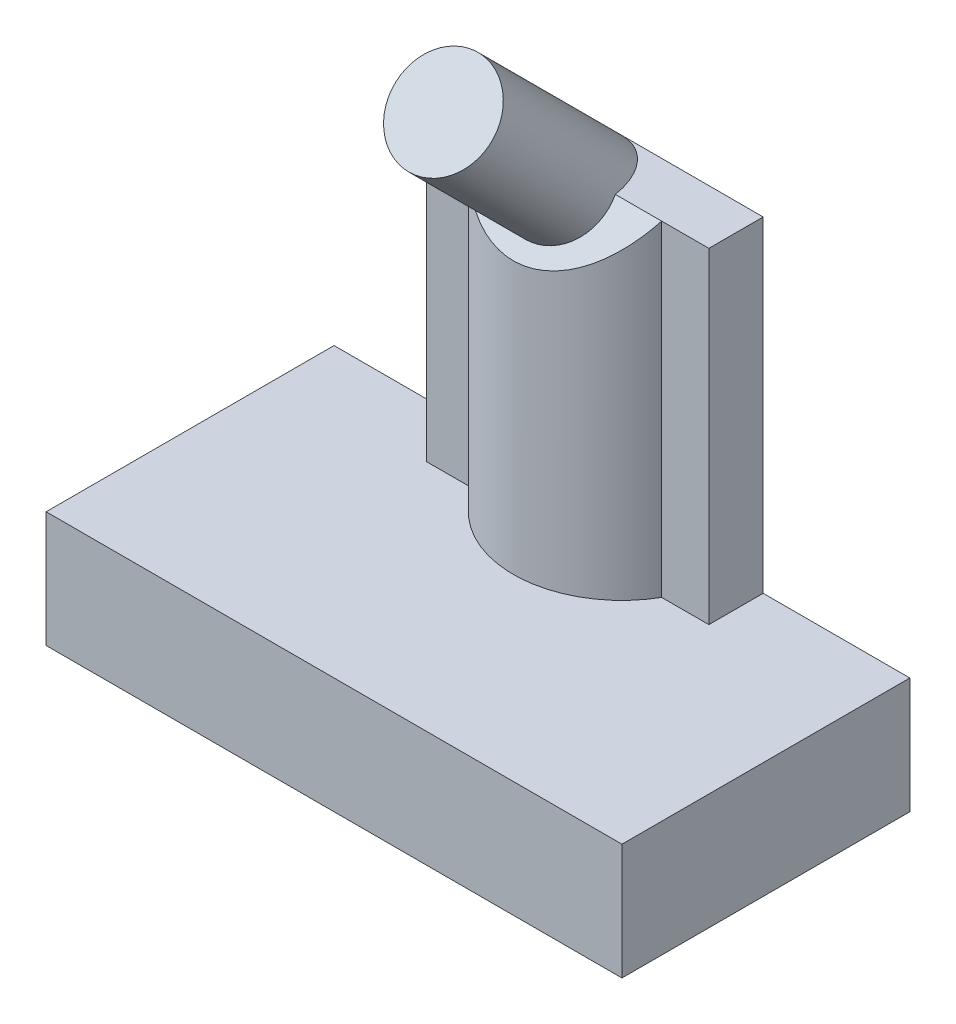
ISO-10303-21;
HEADER;
FILE_DESCRIPTION(('STEP AP214'),'2;1');
FILE_NAME('part.step','',(''),(''),'','','');
FILE_SCHEMA(('AUTOMOTIVE_DESIGN { 1 0 10303 214 1 1 1 1 }'));
ENDSEC;
DATA;
#1=APPLICATION_CONTEXT('core data for automotive mechanical design processes');
#2=APPLICATION_PROTOCOL_DEFINITION('international standard','automotive_design',2000,#1);
#3=PRODUCT_CONTEXT('',#1,'mechanical');
#4=PRODUCT('Part','Part','',(#3));
#5=PRODUCT_RELATED_PRODUCT_CATEGORY('part','',(#4));
#6=PRODUCT_DEFINITION_FORMATION('','',#4);
#7=PRODUCT_DEFINITION_CONTEXT('part definition',#1,'design');
#8=PRODUCT_DEFINITION('design','',#6,#7);
#9=PRODUCT_DEFINITION_SHAPE('','',#8);
#10=(LENGTH_UNIT() NAMED_UNIT(*) SI_UNIT(.MILLI.,.METRE.));
#11=(NAMED_UNIT(*) PLANE_ANGLE_UNIT() SI_UNIT($,.RADIAN.));
#12=(NAMED_UNIT(*) SI_UNIT($,.STERADIAN.) SOLID_ANGLE_UNIT());
#13=UNCERTAINTY_MEASURE_WITH_UNIT(LENGTH_MEASURE(1.E-05),#10,'distance_accuracy_value','');
#14=(GEOMETRIC_REPRESENTATION_CONTEXT(3) GLOBAL_UNCERTAINTY_ASSIGNED_CONTEXT((#13)) GLOBAL_UNIT_ASSIGNED_CONTEXT((#10,
#11,#12)) REPRESENTATION_CONTEXT('',''));
#15=CARTESIAN_POINT('',(0.,0.,0.));
#16=DIRECTION('',(0.,0.,1.));
#17=DIRECTION('',(1.,0.,0.));
#18=AXIS2_PLACEMENT_3D('',#15,#16,#17);
#19=CARTESIAN_POINT('',(0.,12.2,-3.97500000000002));
#20=DIRECTION('',(0.,1.,0.));
#21=DIRECTION('',(0.,0.,1.));
#22=AXIS2_PLACEMENT_3D('',#19,#20,#21);
#23=PLANE('',#22);
#24=CARTESIAN_POINT('',(0.,12.2,-2.06581169079635));
#25=DIRECTION('',(0.,1.,0.));
#26=DIRECTION('',(0.,0.,1.));
#27=AXIS2_PLACEMENT_3D('',#24,#25,#26);
#28=ELLIPSE('',#27,1.90918830920368,1.35);
#29=CARTESIAN_POINT('',(1.31881276962224,12.2,-2.47381384442135));
#30=VERTEX_POINT('',#29);
#31=CARTESIAN_POINT('',(0.,12.2,-3.97500000000002));
#32=VERTEX_POINT('',#31);
#33=EDGE_CURVE('E163',#30,#32,#28,.T.);
#34=ORIENTED_EDGE('',*,*,#33,.F.);
#35=DIRECTION('',(1.,0.,0.));
#36=VECTOR('',#35,1.);
#37=CARTESIAN_POINT('',(0.,12.2,-2.47381384442135));
#38=LINE('',#37,#36);
#39=CARTESIAN_POINT('',(2.59739102298805,12.2,-2.47381384442135));
#40=VERTEX_POINT('',#39);
#41=EDGE_CURVE('E152',#30,#40,#38,.T.);
#42=ORIENTED_EDGE('',*,*,#41,.T.);
#43=CARTESIAN_POINT('',(0.,12.2,-3.97500000000002));
#44=DIRECTION('',(0.,1.,0.));
#45=DIRECTION('',(0.,0.,1.));
#46=AXIS2_PLACEMENT_3D('',#43,#44,#45);
#47=CIRCLE('',#46,3.);
#48=CARTESIAN_POINT('',(2.59807621135332,12.2,-2.47500000000002));
#49=VERTEX_POINT('',#48);
#50=EDGE_CURVE('E189',#40,#49,#47,.T.);
#51=ORIENTED_EDGE('',*,*,#50,.T.);
#52=DIRECTION('',(1.,0.,0.));
#53=VECTOR('',#52,1.);
#54=CARTESIAN_POINT('',(2.59807621135332,12.2,-2.47500000000002));
#55=LINE('',#54,#53);
#56=CARTESIAN_POINT('',(3.9,12.2,-2.47500000000002));
#57=VERTEX_POINT('',#56);
#58=EDGE_CURVE('E194',#49,#57,#55,.T.);
#59=ORIENTED_EDGE('',*,*,#58,.T.);
#60=DIRECTION('',(0.,0.,-1.));
#61=VECTOR('',#60,1.);
#62=CARTESIAN_POINT('',(3.9,12.2,-2.47500000000002));
#63=LINE('',#62,#61);
#64=CARTESIAN_POINT('',(3.9,12.2,-3.97500000000002));
#65=VERTEX_POINT('',#64);
#66=EDGE_CURVE('E197',#57,#65,#63,.T.);
#67=ORIENTED_EDGE('',*,*,#66,.T.);
#68=DIRECTION('',(-1.,0.,0.));
#69=VECTOR('',#68,1.);
#70=CARTESIAN_POINT('',(3.9,12.2,-3.97500000000002));
#71=LINE('',#70,#69);
#72=EDGE_CURVE('E165',#65,#32,#71,.T.);
#73=ORIENTED_EDGE('',*,*,#72,.T.);
#74=EDGE_LOOP('',(#34,#42,#51,#59,#67,#73));
#75=FACE_BOUND('',#74,.T.);
#76=ADVANCED_FACE('F39',(#75),#23,.T.);
#77=CARTESIAN_POINT('',(0.,12.2,-3.97500000000002));
#78=DIRECTION('',(0.,-1.,0.));
#79=DIRECTION('',(0.,0.,-1.));
#80=AXIS2_PLACEMENT_3D('',#77,#78,#79);
#81=CYLINDRICAL_SURFACE('',#80,3.);
#82=CARTESIAN_POINT('',(0.,13.7011861555787,-3.97500000000002));
#83=DIRECTION('',(0.,0.707106781186547,0.707106781186548));
#84=DIRECTION('',(0.,-0.707106781186548,0.707106781186547));
#85=AXIS2_PLACEMENT_3D('',#82,#83,#84);
#86=ELLIPSE('',#85,4.24264068711929,3.);
#87=CARTESIAN_POINT('',(-2.59739102298805,12.2,-2.47381384442135));
#88=VERTEX_POINT('',#87);
#89=EDGE_CURVE('E156',#88,#40,#86,.T.);
#90=ORIENTED_EDGE('',*,*,#89,.F.);
#91=CARTESIAN_POINT('',(-2.59807621135332,12.2,-2.47500000000002));
#92=VERTEX_POINT('',#91);
#93=EDGE_CURVE('E190',#92,#88,#47,.T.);
#94=ORIENTED_EDGE('',*,*,#93,.F.);
#95=DIRECTION('',(0.,-1.,0.));
#96=VECTOR('',#95,1.);
#97=CARTESIAN_POINT('',(-2.59807621135332,12.2,-2.47500000000002));
#98=LINE('',#97,#96);
#99=CARTESIAN_POINT('',(-2.59807621135332,3.2,-2.47500000000002));
#100=VERTEX_POINT('',#99);
#101=EDGE_CURVE('E231',#92,#100,#98,.T.);
#102=ORIENTED_EDGE('',*,*,#101,.T.);
#103=CARTESIAN_POINT('',(0.,3.2,-3.97500000000002));
#104=DIRECTION('',(0.,1.,0.));
#105=DIRECTION('',(0.,0.,1.));
#106=AXIS2_PLACEMENT_3D('',#103,#104,#105);
#107=CIRCLE('',#106,3.);
#108=CARTESIAN_POINT('',(2.59807621135332,3.2,-2.47500000000002));
#109=VERTEX_POINT('',#108);
#110=EDGE_CURVE('E208',#100,#109,#107,.T.);
#111=ORIENTED_EDGE('',*,*,#110,.T.);
#112=DIRECTION('',(0.,-1.,0.));
#113=VECTOR('',#112,1.);
#114=CARTESIAN_POINT('',(2.59807621135332,12.2,-2.47500000000002));
#115=LINE('',#114,#113);
#116=EDGE_CURVE('E227',#49,#109,#115,.T.);
#117=ORIENTED_EDGE('',*,*,#116,.F.);
#118=ORIENTED_EDGE('',*,*,#50,.F.);
#119=EDGE_LOOP('',(#90,#94,#102,#111,#117,#118));
#120=FACE_BOUND('',#119,.T.);
#121=ADVANCED_FACE('F347',(#120),#81,.T.);
#122=CARTESIAN_POINT('',(-1.31881276962224,12.2,-2.47381384442135));
#123=VERTEX_POINT('',#122);
#124=EDGE_CURVE('E55',#32,#123,#28,.T.);
#125=ORIENTED_EDGE('',*,*,#124,.F.);
#126=CARTESIAN_POINT('',(-3.9,12.2,-3.97500000000002));
#127=VERTEX_POINT('',#126);
#128=EDGE_CURVE('E183',#32,#127,#71,.T.);
#129=ORIENTED_EDGE('',*,*,#128,.T.);
#130=DIRECTION('',(0.,0.,1.));
#131=VECTOR('',#130,1.);
#132=CARTESIAN_POINT('',(-3.9,12.2,-3.97500000000002));
#133=LINE('',#132,#131);
#134=CARTESIAN_POINT('',(-3.9,12.2,-2.47500000000002));
#135=VERTEX_POINT('',#134);
#136=EDGE_CURVE('E182',#127,#135,#133,.T.);
#137=ORIENTED_EDGE('',*,*,#136,.T.);
#138=DIRECTION('',(1.,0.,0.));
#139=VECTOR('',#138,1.);
#140=CARTESIAN_POINT('',(-3.9,12.2,-2.47500000000002));
#141=LINE('',#140,#139);
#142=EDGE_CURVE('E186',#135,#92,#141,.T.);
#143=ORIENTED_EDGE('',*,*,#142,.T.);
#144=ORIENTED_EDGE('',*,*,#93,.T.);
#145=EDGE_CURVE('E48',#88,#123,#38,.T.);
#146=ORIENTED_EDGE('',*,*,#145,.T.);
#147=EDGE_LOOP('',(#125,#129,#137,#143,#144,#146));
#148=FACE_BOUND('',#147,.T.);
#149=ADVANCED_FACE('F344',(#148),#23,.T.);
#150=CARTESIAN_POINT('',(0.,3.2,0.));
#151=DIRECTION('',(0.,-1.,0.));
#152=DIRECTION('',(0.,0.,-1.));
#153=AXIS2_PLACEMENT_3D('',#150,#151,#152);
#154=PLANE('',#153);
#155=DIRECTION('',(0.,0.,-1.));
#156=VECTOR('',#155,1.);
#157=CARTESIAN_POINT('',(3.9,3.2,-2.47500000000002));
#158=LINE('',#157,#156);
#159=CARTESIAN_POINT('',(3.9,3.2,-2.47500000000002));
#160=VERTEX_POINT('',#159);
#161=CARTESIAN_POINT('',(3.9,3.2,-3.97500000000002));
#162=VERTEX_POINT('',#161);
#163=EDGE_CURVE('E216',#160,#162,#158,.T.);
#164=ORIENTED_EDGE('',*,*,#163,.F.);
#165=DIRECTION('',(1.,0.,0.));
#166=VECTOR('',#165,1.);
#167=CARTESIAN_POINT('',(2.59807621135332,3.2,-2.47500000000002));
#168=LINE('',#167,#166);
#169=EDGE_CURVE('E212',#109,#160,#168,.T.);
#170=ORIENTED_EDGE('',*,*,#169,.F.);
#171=ORIENTED_EDGE('',*,*,#110,.F.);
#172=DIRECTION('',(1.,0.,0.));
#173=VECTOR('',#172,1.);
#174=CARTESIAN_POINT('',(-3.9,3.2,-2.47500000000002));
#175=LINE('',#174,#173);
#176=CARTESIAN_POINT('',(-3.9,3.2,-2.47500000000002));
#177=VERTEX_POINT('',#176);
#178=EDGE_CURVE('E204',#177,#100,#175,.T.);
#179=ORIENTED_EDGE('',*,*,#178,.F.);
#180=DIRECTION('',(0.,0.,1.));
#181=VECTOR('',#180,1.);
#182=CARTESIAN_POINT('',(-3.9,3.2,-3.97500000000002));
#183=LINE('',#182,#181);
#184=CARTESIAN_POINT('',(-3.9,3.2,-3.97500000000002));
#185=VERTEX_POINT('',#184);
#186=EDGE_CURVE('E179',#185,#177,#183,.T.);
#187=ORIENTED_EDGE('',*,*,#186,.F.);
#188=DIRECTION('',(-1.,0.,0.));
#189=VECTOR('',#188,1.);
#190=CARTESIAN_POINT('',(-7.94999999999991,3.2,-3.97500000000002));
#191=LINE('',#190,#189);
#192=CARTESIAN_POINT('',(-7.94999999999991,3.2,-3.97500000000002));
#193=VERTEX_POINT('',#192);
#194=EDGE_CURVE('E303',#185,#193,#191,.T.);
#195=ORIENTED_EDGE('',*,*,#194,.T.);
#196=DIRECTION('',(0.,0.,1.));
#197=VECTOR('',#196,1.);
#198=CARTESIAN_POINT('',(-7.94999999999991,3.2,3.97499999999996));
#199=LINE('',#198,#197);
#200=CARTESIAN_POINT('',(-7.94999999999991,3.2,3.97499999999996));
#201=VERTEX_POINT('',#200);
#202=EDGE_CURVE('E308',#193,#201,#199,.T.);
#203=ORIENTED_EDGE('',*,*,#202,.T.);
#204=DIRECTION('',(1.,0.,0.));
#205=VECTOR('',#204,1.);
#206=CARTESIAN_POINT('',(-7.94999999999991,3.2,3.97499999999996));
#207=LINE('',#206,#205);
#208=CARTESIAN_POINT('',(7.95000000000009,3.2,3.97499999999996));
#209=VERTEX_POINT('',#208);
#210=EDGE_CURVE('E311',#201,#209,#207,.T.);
#211=ORIENTED_EDGE('',*,*,#210,.T.);
#212=DIRECTION('',(0.,0.,-1.));
#213=VECTOR('',#212,1.);
#214=CARTESIAN_POINT('',(7.95000000000009,3.2,3.97499999999996));
#215=LINE('',#214,#213);
#216=CARTESIAN_POINT('',(7.95000000000009,3.2,-3.97500000000002));
#217=VERTEX_POINT('',#216);
#218=EDGE_CURVE('E299',#209,#217,#215,.T.);
#219=ORIENTED_EDGE('',*,*,#218,.T.);
#220=EDGE_CURVE('E305',#217,#162,#191,.T.);
#221=ORIENTED_EDGE('',*,*,#220,.T.);
#222=EDGE_LOOP('',(#164,#170,#171,#179,#187,#195,#203,#211,#219,#221));
#223=FACE_BOUND('',#222,.T.);
#224=ADVANCED_FACE('F365',(#223),#154,.F.);
#225=CARTESIAN_POINT('',(0.,0.,0.));
#226=DIRECTION('',(0.,-1.,0.));
#227=DIRECTION('',(0.,0.,-1.));
#228=AXIS2_PLACEMENT_3D('',#225,#226,#227);
#229=PLANE('',#228);
#230=DIRECTION('',(0.,0.,-1.));
#231=VECTOR('',#230,1.);
#232=CARTESIAN_POINT('',(7.95000000000009,0.,3.97499999999996));
#233=LINE('',#232,#231);
#234=CARTESIAN_POINT('',(7.95000000000009,0.,3.97499999999996));
#235=VERTEX_POINT('',#234);
#236=CARTESIAN_POINT('',(7.95000000000009,0.,-3.97500000000002));
#237=VERTEX_POINT('',#236);
#238=EDGE_CURVE('E260',#235,#237,#233,.T.);
#239=ORIENTED_EDGE('',*,*,#238,.F.);
#240=DIRECTION('',(1.,0.,0.));
#241=VECTOR('',#240,1.);
#242=CARTESIAN_POINT('',(-7.94999999999991,0.,3.97499999999996));
#243=LINE('',#242,#241);
#244=CARTESIAN_POINT('',(-7.94999999999991,0.,3.97499999999996));
#245=VERTEX_POINT('',#244);
#246=EDGE_CURVE('E304',#245,#235,#243,.T.);
#247=ORIENTED_EDGE('',*,*,#246,.F.);
#248=DIRECTION('',(0.,0.,1.));
#249=VECTOR('',#248,1.);
#250=CARTESIAN_POINT('',(-7.94999999999991,0.,3.97499999999996));
#251=LINE('',#250,#249);
#252=CARTESIAN_POINT('',(-7.94999999999991,0.,-3.97500000000002));
#253=VERTEX_POINT('',#252);
#254=EDGE_CURVE('E321',#253,#245,#251,.T.);
#255=ORIENTED_EDGE('',*,*,#254,.F.);
#256=DIRECTION('',(-1.,0.,0.));
#257=VECTOR('',#256,1.);
#258=CARTESIAN_POINT('',(-7.94999999999991,0.,-3.97500000000002));
#259=LINE('',#258,#257);
#260=EDGE_CURVE('E318',#237,#253,#259,.T.);
#261=ORIENTED_EDGE('',*,*,#260,.F.);
#262=EDGE_LOOP('',(#239,#247,#255,#261));
#263=FACE_BOUND('',#262,.T.);
#264=DIRECTION('',(1.,0.,0.));
#265=VECTOR('',#264,1.);
#266=CARTESIAN_POINT('',(0.,0.,2.77499999999996));
#267=LINE('',#266,#265);
#268=CARTESIAN_POINT('',(-6.74999999999991,0.,2.77499999999996));
#269=VERTEX_POINT('',#268);
#270=CARTESIAN_POINT('',(6.75000000000009,0.,2.77499999999996));
#271=VERTEX_POINT('',#270);
#272=EDGE_CURVE('E267',#269,#271,#267,.T.);
#273=ORIENTED_EDGE('',*,*,#272,.T.);
#274=DIRECTION('',(0.,0.,-1.));
#275=VECTOR('',#274,1.);
#276=CARTESIAN_POINT('',(6.75000000000009,0.,0.));
#277=LINE('',#276,#275);
#278=CARTESIAN_POINT('',(6.75000000000009,0.,-2.77500000000002));
#279=VERTEX_POINT('',#278);
#280=EDGE_CURVE('E248',#271,#279,#277,.T.);
#281=ORIENTED_EDGE('',*,*,#280,.T.);
#282=DIRECTION('',(-1.,0.,0.));
#283=VECTOR('',#282,1.);
#284=CARTESIAN_POINT('',(0.,0.,-2.77500000000002));
#285=LINE('',#284,#283);
#286=CARTESIAN_POINT('',(-6.74999999999991,0.,-2.77500000000002));
#287=VERTEX_POINT('',#286);
#288=EDGE_CURVE('E288',#279,#287,#285,.T.);
#289=ORIENTED_EDGE('',*,*,#288,.T.);
#290=DIRECTION('',(0.,0.,1.));
#291=VECTOR('',#290,1.);
#292=CARTESIAN_POINT('',(-6.74999999999991,0.,0.));
#293=LINE('',#292,#291);
#294=EDGE_CURVE('E292',#287,#269,#293,.T.);
#295=ORIENTED_EDGE('',*,*,#294,.T.);
#296=EDGE_LOOP('',(#273,#281,#289,#295));
#297=FACE_BOUND('',#296,.T.);
#298=ADVANCED_FACE('F385',(#263,#297),#229,.T.);
#299=CARTESIAN_POINT('',(7.95000000000009,3.2,3.97499999999996));
#300=DIRECTION('',(-1.,0.,0.));
#301=DIRECTION('',(0.,0.,1.));
#302=AXIS2_PLACEMENT_3D('',#299,#300,#301);
#303=PLANE('',#302);
#304=ORIENTED_EDGE('',*,*,#238,.T.);
#305=DIRECTION('',(0.,-1.,0.));
#306=VECTOR('',#305,1.);
#307=CARTESIAN_POINT('',(7.95000000000009,3.2,-3.97500000000002));
#308=LINE('',#307,#306);
#309=EDGE_CURVE('E337',#217,#237,#308,.T.);
#310=ORIENTED_EDGE('',*,*,#309,.F.);
#311=ORIENTED_EDGE('',*,*,#218,.F.);
#312=DIRECTION('',(0.,-1.,0.));
#313=VECTOR('',#312,1.);
#314=CARTESIAN_POINT('',(7.95000000000009,3.2,3.97499999999996));
#315=LINE('',#314,#313);
#316=EDGE_CURVE('E314',#209,#235,#315,.T.);
#317=ORIENTED_EDGE('',*,*,#316,.T.);
#318=EDGE_LOOP('',(#304,#310,#311,#317));
#319=FACE_BOUND('',#318,.T.);
#320=ADVANCED_FACE('F41',(#319),#303,.F.);
#321=CARTESIAN_POINT('',(-7.94999999999991,3.2,-3.97500000000002));
#322=DIRECTION('',(0.,0.,1.));
#323=DIRECTION('',(1.,0.,0.));
#324=AXIS2_PLACEMENT_3D('',#321,#322,#323);
#325=PLANE('',#324);
#326=ORIENTED_EDGE('',*,*,#260,.T.);
#327=DIRECTION('',(0.,-1.,0.));
#328=VECTOR('',#327,1.);
#329=CARTESIAN_POINT('',(-7.94999999999991,3.2,-3.97500000000002));
#330=LINE('',#329,#328);
#331=EDGE_CURVE('E333',#193,#253,#330,.T.);
#332=ORIENTED_EDGE('',*,*,#331,.F.);
#333=ORIENTED_EDGE('',*,*,#194,.F.);
#334=DIRECTION('',(0.,-1.,0.));
#335=VECTOR('',#334,1.);
#336=CARTESIAN_POINT('',(-3.9,12.2,-3.97500000000002));
#337=LINE('',#336,#335);
#338=EDGE_CURVE('E239',#127,#185,#337,.T.);
#339=ORIENTED_EDGE('',*,*,#338,.F.);
#340=ORIENTED_EDGE('',*,*,#128,.F.);
#341=ORIENTED_EDGE('',*,*,#72,.F.);
#342=DIRECTION('',(0.,-1.,0.));
#343=VECTOR('',#342,1.);
#344=CARTESIAN_POINT('',(3.9,12.2,-3.97500000000002));
#345=LINE('',#344,#343);
#346=EDGE_CURVE('E200',#65,#162,#345,.T.);
#347=ORIENTED_EDGE('',*,*,#346,.T.);
#348=ORIENTED_EDGE('',*,*,#220,.F.);
#349=ORIENTED_EDGE('',*,*,#309,.T.);
#350=EDGE_LOOP('',(#326,#332,#333,#339,#340,#341,#347,#348,#349));
#351=FACE_BOUND('',#350,.T.);
#352=ADVANCED_FACE('F360',(#351),#325,.F.);
#353=CARTESIAN_POINT('',(-7.94999999999991,3.2,3.97499999999996));
#354=DIRECTION('',(1.,0.,0.));
#355=DIRECTION('',(0.,0.,-1.));
#356=AXIS2_PLACEMENT_3D('',#353,#354,#355);
#357=PLANE('',#356);
#358=ORIENTED_EDGE('',*,*,#254,.T.);
#359=DIRECTION('',(0.,-1.,0.));
#360=VECTOR('',#359,1.);
#361=CARTESIAN_POINT('',(-7.94999999999991,3.2,3.97499999999996));
#362=LINE('',#361,#360);
#363=EDGE_CURVE('E329',#201,#245,#362,.T.);
#364=ORIENTED_EDGE('',*,*,#363,.F.);
#365=ORIENTED_EDGE('',*,*,#202,.F.);
#366=ORIENTED_EDGE('',*,*,#331,.T.);
#367=EDGE_LOOP('',(#358,#364,#365,#366));
#368=FACE_BOUND('',#367,.T.);
#369=ADVANCED_FACE('F389',(#368),#357,.F.);
#370=CARTESIAN_POINT('',(-7.94999999999991,3.2,3.97499999999996));
#371=DIRECTION('',(0.,0.,-1.));
#372=DIRECTION('',(-1.,0.,0.));
#373=AXIS2_PLACEMENT_3D('',#370,#371,#372);
#374=PLANE('',#373);
#375=ORIENTED_EDGE('',*,*,#246,.T.);
#376=ORIENTED_EDGE('',*,*,#316,.F.);
#377=ORIENTED_EDGE('',*,*,#210,.F.);
#378=ORIENTED_EDGE('',*,*,#363,.T.);
#379=EDGE_LOOP('',(#375,#376,#377,#378));
#380=FACE_BOUND('',#379,.T.);
#381=ADVANCED_FACE('F391',(#380),#374,.F.);
#382=CARTESIAN_POINT('',(6.75000000000009,3.2,3.97499999999996));
#383=DIRECTION('',(-1.,0.,0.));
#384=DIRECTION('',(0.,0.,1.));
#385=AXIS2_PLACEMENT_3D('',#382,#383,#384);
#386=PLANE('',#385);
#387=ORIENTED_EDGE('',*,*,#280,.F.);
#388=DIRECTION('',(0.,-1.,0.));
#389=VECTOR('',#388,1.);
#390=CARTESIAN_POINT('',(6.75000000000009,3.2,2.77499999999996));
#391=LINE('',#390,#389);
#392=CARTESIAN_POINT('',(6.75000000000009,2.,2.77499999999996));
#393=VERTEX_POINT('',#392);
#394=EDGE_CURVE('E268',#393,#271,#391,.T.);
#395=ORIENTED_EDGE('',*,*,#394,.F.);
#396=DIRECTION('',(0.,0.,-1.));
#397=VECTOR('',#396,1.);
#398=CARTESIAN_POINT('',(6.75000000000009,2.,0.));
#399=LINE('',#398,#397);
#400=CARTESIAN_POINT('',(6.75000000000009,2.,-2.77500000000002));
#401=VERTEX_POINT('',#400);
#402=EDGE_CURVE('E262',#393,#401,#399,.T.);
#403=ORIENTED_EDGE('',*,*,#402,.T.);
#404=DIRECTION('',(0.,-1.,0.));
#405=VECTOR('',#404,1.);
#406=CARTESIAN_POINT('',(6.75000000000009,3.2,-2.77500000000002));
#407=LINE('',#406,#405);
#408=EDGE_CURVE('E256',#401,#279,#407,.T.);
#409=ORIENTED_EDGE('',*,*,#408,.T.);
#410=EDGE_LOOP('',(#387,#395,#403,#409));
#411=FACE_BOUND('',#410,.T.);
#412=ADVANCED_FACE('F393',(#411),#386,.T.);
#413=CARTESIAN_POINT('',(-7.94999999999991,3.2,-2.77500000000002));
#414=DIRECTION('',(0.,0.,1.));
#415=DIRECTION('',(1.,0.,0.));
#416=AXIS2_PLACEMENT_3D('',#413,#414,#415);
#417=PLANE('',#416);
#418=ORIENTED_EDGE('',*,*,#288,.F.);
#419=ORIENTED_EDGE('',*,*,#408,.F.);
#420=DIRECTION('',(-1.,0.,0.));
#421=VECTOR('',#420,1.);
#422=CARTESIAN_POINT('',(0.,2.,-2.77500000000002));
#423=LINE('',#422,#421);
#424=CARTESIAN_POINT('',(-6.74999999999991,2.,-2.77500000000002));
#425=VERTEX_POINT('',#424);
#426=EDGE_CURVE('E266',#401,#425,#423,.T.);
#427=ORIENTED_EDGE('',*,*,#426,.T.);
#428=DIRECTION('',(0.,-1.,0.));
#429=VECTOR('',#428,1.);
#430=CARTESIAN_POINT('',(-6.74999999999991,3.2,-2.77500000000002));
#431=LINE('',#430,#429);
#432=EDGE_CURVE('E261',#425,#287,#431,.T.);
#433=ORIENTED_EDGE('',*,*,#432,.T.);
#434=EDGE_LOOP('',(#418,#419,#427,#433));
#435=FACE_BOUND('',#434,.T.);
#436=ADVANCED_FACE('F399',(#435),#417,.T.);
#437=CARTESIAN_POINT('',(-6.74999999999991,3.2,3.97499999999996));
#438=DIRECTION('',(1.,0.,0.));
#439=DIRECTION('',(0.,0.,-1.));
#440=AXIS2_PLACEMENT_3D('',#437,#438,#439);
#441=PLANE('',#440);
#442=ORIENTED_EDGE('',*,*,#294,.F.);
#443=ORIENTED_EDGE('',*,*,#432,.F.);
#444=DIRECTION('',(0.,0.,1.));
#445=VECTOR('',#444,1.);
#446=CARTESIAN_POINT('',(-6.74999999999991,2.,0.));
#447=LINE('',#446,#445);
#448=CARTESIAN_POINT('',(-6.74999999999991,2.,2.77499999999996));
#449=VERTEX_POINT('',#448);
#450=EDGE_CURVE('E278',#425,#449,#447,.T.);
#451=ORIENTED_EDGE('',*,*,#450,.T.);
#452=DIRECTION('',(0.,-1.,0.));
#453=VECTOR('',#452,1.);
#454=CARTESIAN_POINT('',(-6.74999999999991,3.2,2.77499999999996));
#455=LINE('',#454,#453);
#456=EDGE_CURVE('E271',#449,#269,#455,.T.);
#457=ORIENTED_EDGE('',*,*,#456,.T.);
#458=EDGE_LOOP('',(#442,#443,#451,#457));
#459=FACE_BOUND('',#458,.T.);
#460=ADVANCED_FACE('F430',(#459),#441,.T.);
#461=CARTESIAN_POINT('',(-7.94999999999991,3.2,2.77499999999996));
#462=DIRECTION('',(0.,0.,-1.));
#463=DIRECTION('',(-1.,0.,0.));
#464=AXIS2_PLACEMENT_3D('',#461,#462,#463);
#465=PLANE('',#464);
#466=ORIENTED_EDGE('',*,*,#272,.F.);
#467=ORIENTED_EDGE('',*,*,#456,.F.);
#468=DIRECTION('',(1.,0.,0.));
#469=VECTOR('',#468,1.);
#470=CARTESIAN_POINT('',(0.,2.,2.77499999999996));
#471=LINE('',#470,#469);
#472=EDGE_CURVE('E272',#449,#393,#471,.T.);
#473=ORIENTED_EDGE('',*,*,#472,.T.);
#474=ORIENTED_EDGE('',*,*,#394,.T.);
#475=EDGE_LOOP('',(#466,#467,#473,#474));
#476=FACE_BOUND('',#475,.T.);
#477=ADVANCED_FACE('F425',(#476),#465,.T.);
#478=CARTESIAN_POINT('',(0.,2.,0.));
#479=DIRECTION('',(0.,-1.,0.));
#480=DIRECTION('',(0.,0.,-1.));
#481=AXIS2_PLACEMENT_3D('',#478,#479,#480);
#482=PLANE('',#481);
#483=CARTESIAN_POINT('',(0.,2.,0.));
#484=DIRECTION('',(0.,-1.,0.));
#485=DIRECTION('',(0.,0.,-1.));
#486=AXIS2_PLACEMENT_3D('',#483,#484,#485);
#487=CIRCLE('',#486,1.525);
#488=CARTESIAN_POINT('',(0.,2.,-1.525));
#489=VERTEX_POINT('',#488);
#490=EDGE_CURVE('E249',#489,#489,#487,.T.);
#491=ORIENTED_EDGE('',*,*,#490,.F.);
#492=EDGE_LOOP('',(#491));
#493=FACE_BOUND('',#492,.T.);
#494=ORIENTED_EDGE('',*,*,#402,.F.);
#495=ORIENTED_EDGE('',*,*,#472,.F.);
#496=ORIENTED_EDGE('',*,*,#450,.F.);
#497=ORIENTED_EDGE('',*,*,#426,.F.);
#498=EDGE_LOOP('',(#494,#495,#496,#497));
#499=FACE_BOUND('',#498,.T.);
#500=ADVANCED_FACE('F421',(#493,#499),#482,.T.);
#501=CARTESIAN_POINT('',(0.,-4.31335136523794,0.));
#502=DIRECTION('',(0.,1.,0.));
#503=DIRECTION('',(0.,0.,1.));
#504=AXIS2_PLACEMENT_3D('',#501,#502,#503);
#505=CYLINDRICAL_SURFACE('',#504,1.525);
#506=ORIENTED_EDGE('',*,*,#490,.T.);
#507=EDGE_LOOP('',(#506));
#508=FACE_BOUND('',#507,.T.);
#509=CARTESIAN_POINT('',(0.,0.,0.));
#510=DIRECTION('',(0.,-1.,0.));
#511=DIRECTION('',(0.,0.,-1.));
#512=AXIS2_PLACEMENT_3D('',#509,#510,#511);
#513=CIRCLE('',#512,1.525);
#514=CARTESIAN_POINT('',(0.,0.,-1.525));
#515=VERTEX_POINT('',#514);
#516=EDGE_CURVE('E244',#515,#515,#513,.T.);
#517=ORIENTED_EDGE('',*,*,#516,.F.);
#518=EDGE_LOOP('',(#517));
#519=FACE_BOUND('',#518,.T.);
#520=ADVANCED_FACE('F424',(#508,#519),#505,.T.);
#521=CARTESIAN_POINT('',(0.,-4.31335136523794,0.));
#522=DIRECTION('',(0.,1.,0.));
#523=DIRECTION('',(0.,0.,1.));
#524=AXIS2_PLACEMENT_3D('',#521,#522,#523);
#525=CYLINDRICAL_SURFACE('',#524,0.5);
#526=CARTESIAN_POINT('',(0.,2.,0.));
#527=DIRECTION('',(0.,-1.,0.));
#528=DIRECTION('',(0.,0.,-1.));
#529=AXIS2_PLACEMENT_3D('',#526,#527,#528);
#530=CIRCLE('',#529,0.5);
#531=CARTESIAN_POINT('',(0.,2.,-0.5));
#532=VERTEX_POINT('',#531);
#533=EDGE_CURVE('E160',#532,#532,#530,.F.);
#534=ORIENTED_EDGE('',*,*,#533,.T.);
#535=EDGE_LOOP('',(#534));
#536=FACE_BOUND('',#535,.T.);
#537=CARTESIAN_POINT('',(0.,0.,0.));
#538=DIRECTION('',(0.,-1.,0.));
#539=DIRECTION('',(0.,0.,-1.));
#540=AXIS2_PLACEMENT_3D('',#537,#538,#539);
#541=CIRCLE('',#540,0.5);
#542=CARTESIAN_POINT('',(0.,0.,-0.5));
#543=VERTEX_POINT('',#542);
#544=EDGE_CURVE('E243',#543,#543,#541,.T.);
#545=ORIENTED_EDGE('',*,*,#544,.T.);
#546=EDGE_LOOP('',(#545));
#547=FACE_BOUND('',#546,.T.);
#548=ADVANCED_FACE('F440',(#536,#547),#525,.F.);
#549=CARTESIAN_POINT('',(0.,0.,0.));
#550=DIRECTION('',(0.,-1.,0.));
#551=DIRECTION('',(0.,0.,-1.));
#552=AXIS2_PLACEMENT_3D('',#549,#550,#551);
#553=PLANE('',#552);
#554=ORIENTED_EDGE('',*,*,#544,.F.);
#555=EDGE_LOOP('',(#554));
#556=FACE_BOUND('',#555,.T.);
#557=ORIENTED_EDGE('',*,*,#516,.T.);
#558=EDGE_LOOP('',(#557));
#559=FACE_BOUND('',#558,.T.);
#560=ADVANCED_FACE('F444',(#556,#559),#553,.T.);
#561=ORIENTED_EDGE('',*,*,#533,.F.);
#562=EDGE_LOOP('',(#561));
#563=FACE_BOUND('',#562,.T.);
#564=ADVANCED_FACE('F427',(#563),#482,.T.);
#565=CARTESIAN_POINT('',(-3.9,12.2,-3.97500000000002));
#566=DIRECTION('',(1.,0.,0.));
#567=DIRECTION('',(0.,0.,-1.));
#568=AXIS2_PLACEMENT_3D('',#565,#566,#567);
#569=PLANE('',#568);
#570=ORIENTED_EDGE('',*,*,#186,.T.);
#571=DIRECTION('',(0.,-1.,0.));
#572=VECTOR('',#571,1.);
#573=CARTESIAN_POINT('',(-3.9,12.2,-2.47500000000002));
#574=LINE('',#573,#572);
#575=EDGE_CURVE('E235',#135,#177,#574,.T.);
#576=ORIENTED_EDGE('',*,*,#575,.F.);
#577=ORIENTED_EDGE('',*,*,#136,.F.);
#578=ORIENTED_EDGE('',*,*,#338,.T.);
#579=EDGE_LOOP('',(#570,#576,#577,#578));
#580=FACE_BOUND('',#579,.T.);
#581=ADVANCED_FACE('F357',(#580),#569,.F.);
#582=CARTESIAN_POINT('',(-3.9,12.2,-2.47500000000002));
#583=DIRECTION('',(0.,0.,-1.));
#584=DIRECTION('',(-1.,0.,0.));
#585=AXIS2_PLACEMENT_3D('',#582,#583,#584);
#586=PLANE('',#585);
#587=ORIENTED_EDGE('',*,*,#178,.T.);
#588=ORIENTED_EDGE('',*,*,#101,.F.);
#589=ORIENTED_EDGE('',*,*,#142,.F.);
#590=ORIENTED_EDGE('',*,*,#575,.T.);
#591=EDGE_LOOP('',(#587,#588,#589,#590));
#592=FACE_BOUND('',#591,.T.);
#593=ADVANCED_FACE('F368',(#592),#586,.F.);
#594=CARTESIAN_POINT('',(2.59807621135332,12.2,-2.47500000000002));
#595=DIRECTION('',(0.,0.,-1.));
#596=DIRECTION('',(-1.,0.,0.));
#597=AXIS2_PLACEMENT_3D('',#594,#595,#596);
#598=PLANE('',#597);
#599=ORIENTED_EDGE('',*,*,#169,.T.);
#600=DIRECTION('',(0.,-1.,0.));
#601=VECTOR('',#600,1.);
#602=CARTESIAN_POINT('',(3.9,12.2,-2.47500000000002));
#603=LINE('',#602,#601);
#604=EDGE_CURVE('E223',#57,#160,#603,.T.);
#605=ORIENTED_EDGE('',*,*,#604,.F.);
#606=ORIENTED_EDGE('',*,*,#58,.F.);
#607=ORIENTED_EDGE('',*,*,#116,.T.);
#608=EDGE_LOOP('',(#599,#605,#606,#607));
#609=FACE_BOUND('',#608,.T.);
#610=ADVANCED_FACE('F371',(#609),#598,.F.);
#611=CARTESIAN_POINT('',(3.9,12.2,-2.47500000000002));
#612=DIRECTION('',(-1.,0.,0.));
#613=DIRECTION('',(0.,0.,1.));
#614=AXIS2_PLACEMENT_3D('',#611,#612,#613);
#615=PLANE('',#614);
#616=ORIENTED_EDGE('',*,*,#163,.T.);
#617=ORIENTED_EDGE('',*,*,#346,.F.);
#618=ORIENTED_EDGE('',*,*,#66,.F.);
#619=ORIENTED_EDGE('',*,*,#604,.T.);
#620=EDGE_LOOP('',(#616,#617,#618,#619));
#621=FACE_BOUND('',#620,.T.);
#622=ADVANCED_FACE('F376',(#621),#615,.F.);
#623=CARTESIAN_POINT('',(0.,4.86309307778932,4.86309307778933));
#624=DIRECTION('',(0.,0.707106781186547,0.707106781186548));
#625=DIRECTION('',(0.,-0.707106781186548,0.707106781186547));
#626=AXIS2_PLACEMENT_3D('',#623,#624,#625);
#627=PLANE('',#626);
#628=CARTESIAN_POINT('',(0.,11.9959989231875,-2.26981276760885));
#629=DIRECTION('',(0.,0.707106781186547,0.707106781186548));
#630=DIRECTION('',(0.,-0.707106781186548,0.707106781186547));
#631=AXIS2_PLACEMENT_3D('',#628,#629,#630);
#632=CIRCLE('',#631,1.35);
#633=EDGE_CURVE('E11',#123,#30,#632,.T.);
#634=ORIENTED_EDGE('',*,*,#633,.F.);
#635=ORIENTED_EDGE('',*,*,#145,.F.);
#636=ORIENTED_EDGE('',*,*,#89,.T.);
#637=ORIENTED_EDGE('',*,*,#41,.F.);
#638=EDGE_LOOP('',(#634,#635,#636,#637));
#639=FACE_BOUND('',#638,.T.);
#640=ADVANCED_FACE('F154',(#639),#627,.T.);
#641=CARTESIAN_POINT('',(0.,11.2454058453982,-3.02040584539819));
#642=DIRECTION('',(0.,0.707106781186547,0.707106781186548));
#643=DIRECTION('',(0.,-0.707106781186548,0.707106781186547));
#644=AXIS2_PLACEMENT_3D('',#641,#642,#643);
#645=CYLINDRICAL_SURFACE('',#644,1.35);
#646=ORIENTED_EDGE('',*,*,#633,.T.);
#647=ORIENTED_EDGE('',*,*,#33,.T.);
#648=ORIENTED_EDGE('',*,*,#124,.T.);
#649=EDGE_LOOP('',(#646,#647,#648));
#650=FACE_BOUND('',#649,.T.);
#651=CARTESIAN_POINT('',(0.,15.2204058453982,0.95459415460181));
#652=DIRECTION('',(0.,0.707106781186547,0.707106781186548));
#653=DIRECTION('',(0.,-0.707106781186548,0.707106781186547));
#654=AXIS2_PLACEMENT_3D('',#651,#652,#653);
#655=CIRCLE('',#654,1.35);
#656=CARTESIAN_POINT('',(0.,14.2658116907963,1.90918830920365));
#657=VERTEX_POINT('',#656);
#658=EDGE_CURVE('E172',#657,#657,#655,.T.);
#659=ORIENTED_EDGE('',*,*,#658,.F.);
#660=EDGE_LOOP('',(#659));
#661=FACE_BOUND('',#660,.T.);
#662=ADVANCED_FACE('F169',(#650,#661),#645,.T.);
#663=CARTESIAN_POINT('',(0.,15.2204058453982,0.95459415460181));
#664=DIRECTION('',(0.,0.707106781186547,0.707106781186548));
#665=DIRECTION('',(0.,-0.707106781186548,0.707106781186547));
#666=AXIS2_PLACEMENT_3D('',#663,#664,#665);
#667=PLANE('',#666);
#668=ORIENTED_EDGE('',*,*,#658,.T.);
#669=EDGE_LOOP('',(#668));
#670=FACE_BOUND('',#669,.T.);
#671=ADVANCED_FACE('F461',(#670),#667,.T.);
#672=CLOSED_SHELL('',(#76,#121,#149,#224,#298,#320,#352,#369,#381,#412,#436,#460,#477,#500,#520,
#548,#560,#564,#581,#593,#610,#622,#640,#662,#671));
#673=MANIFOLD_SOLID_BREP('B2',#672);
#674=ADVANCED_BREP_SHAPE_REPRESENTATION('',(#18,#673),#14);
#675=SHAPE_DEFINITION_REPRESENTATION(#9,#674);
ENDSEC;
END-ISO-10303-21;
